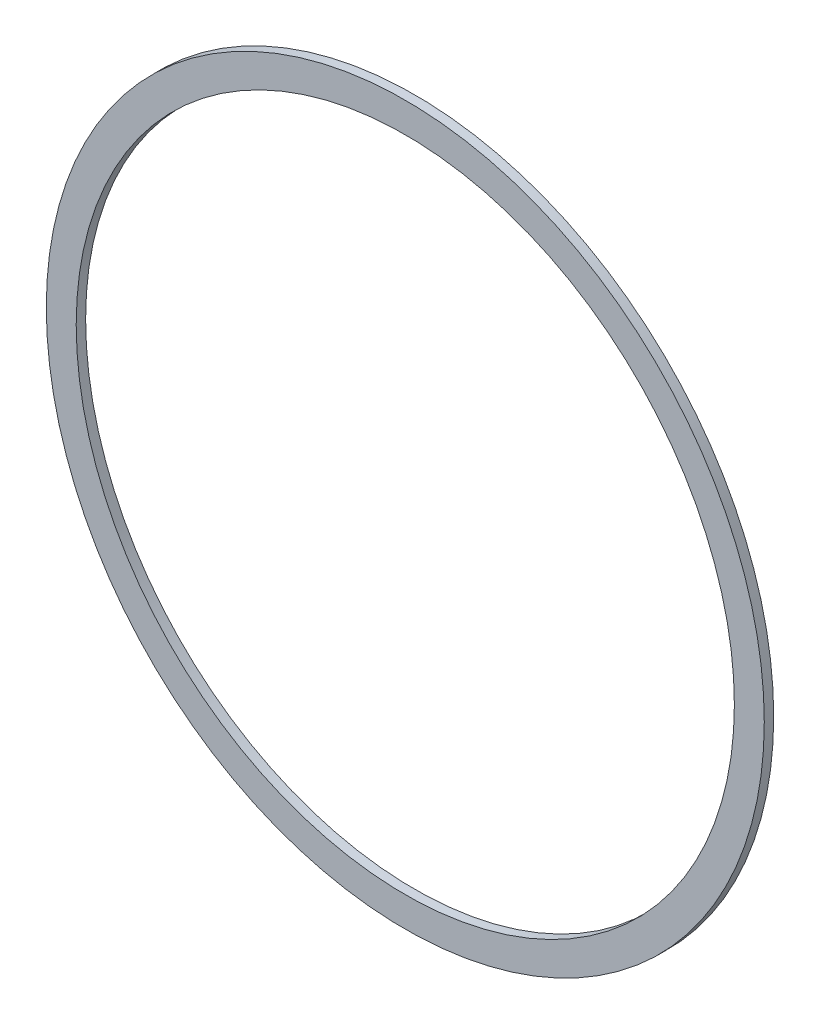
ISO-10303-21;
HEADER;
FILE_DESCRIPTION(('STEP AP214'),'2;1');
FILE_NAME('part.step','',(''),(''),'','','');
FILE_SCHEMA(('AUTOMOTIVE_DESIGN { 1 0 10303 214 1 1 1 1 }'));
ENDSEC;
DATA;
#1=APPLICATION_CONTEXT('core data for automotive mechanical design processes');
#2=APPLICATION_PROTOCOL_DEFINITION('international standard','automotive_design',2000,#1);
#3=PRODUCT_CONTEXT('',#1,'mechanical');
#4=PRODUCT('Part','Part','',(#3));
#5=PRODUCT_RELATED_PRODUCT_CATEGORY('part','',(#4));
#6=PRODUCT_DEFINITION_FORMATION('','',#4);
#7=PRODUCT_DEFINITION_CONTEXT('part definition',#1,'design');
#8=PRODUCT_DEFINITION('design','',#6,#7);
#9=PRODUCT_DEFINITION_SHAPE('','',#8);
#10=(LENGTH_UNIT() NAMED_UNIT(*) SI_UNIT(.MILLI.,.METRE.));
#11=(NAMED_UNIT(*) PLANE_ANGLE_UNIT() SI_UNIT($,.RADIAN.));
#12=(NAMED_UNIT(*) SI_UNIT($,.STERADIAN.) SOLID_ANGLE_UNIT());
#13=UNCERTAINTY_MEASURE_WITH_UNIT(LENGTH_MEASURE(1.E-05),#10,'distance_accuracy_value','');
#14=(GEOMETRIC_REPRESENTATION_CONTEXT(3) GLOBAL_UNCERTAINTY_ASSIGNED_CONTEXT((#13)) GLOBAL_UNIT_ASSIGNED_CONTEXT((#10,
#11,#12)) REPRESENTATION_CONTEXT('',''));
#15=CARTESIAN_POINT('',(0.,0.,0.));
#16=DIRECTION('',(0.,0.,1.));
#17=DIRECTION('',(1.,0.,0.));
#18=AXIS2_PLACEMENT_3D('',#15,#16,#17);
#19=CARTESIAN_POINT('',(0.,0.,1.));
#20=DIRECTION('',(0.,0.,1.));
#21=DIRECTION('',(1.,0.,0.));
#22=AXIS2_PLACEMENT_3D('',#19,#20,#21);
#23=PLANE('',#22);
#24=CARTESIAN_POINT('',(0.,0.,1.));
#25=DIRECTION('',(0.,0.,1.));
#26=DIRECTION('',(1.,0.,0.));
#27=AXIS2_PLACEMENT_3D('',#24,#25,#26);
#28=CIRCLE('',#27,76.2);
#29=CARTESIAN_POINT('',(76.2,0.,1.));
#30=VERTEX_POINT('',#29);
#31=EDGE_CURVE('E10',#30,#30,#28,.T.);
#32=ORIENTED_EDGE('',*,*,#31,.T.);
#33=EDGE_LOOP('',(#32));
#34=FACE_BOUND('',#33,.T.);
#35=CARTESIAN_POINT('',(0.,0.,1.));
#36=DIRECTION('',(0.,0.,1.));
#37=DIRECTION('',(1.,0.,0.));
#38=AXIS2_PLACEMENT_3D('',#35,#36,#37);
#39=CIRCLE('',#38,69.85);
#40=CARTESIAN_POINT('',(69.85,0.,1.));
#41=VERTEX_POINT('',#40);
#42=EDGE_CURVE('E42',#41,#41,#39,.T.);
#43=ORIENTED_EDGE('',*,*,#42,.F.);
#44=EDGE_LOOP('',(#43));
#45=FACE_BOUND('',#44,.T.);
#46=ADVANCED_FACE('F31',(#34,#45),#23,.T.);
#47=CARTESIAN_POINT('',(0.,0.,-1.));
#48=DIRECTION('',(0.,0.,1.));
#49=DIRECTION('',(1.,0.,0.));
#50=AXIS2_PLACEMENT_3D('',#47,#48,#49);
#51=PLANE('',#50);
#52=CARTESIAN_POINT('',(0.,0.,-1.));
#53=DIRECTION('',(0.,0.,1.));
#54=DIRECTION('',(1.,0.,0.));
#55=AXIS2_PLACEMENT_3D('',#52,#53,#54);
#56=CIRCLE('',#55,76.2);
#57=CARTESIAN_POINT('',(76.2,0.,-1.));
#58=VERTEX_POINT('',#57);
#59=EDGE_CURVE('E35',#58,#58,#56,.T.);
#60=ORIENTED_EDGE('',*,*,#59,.F.);
#61=EDGE_LOOP('',(#60));
#62=FACE_BOUND('',#61,.T.);
#63=CARTESIAN_POINT('',(0.,0.,-1.));
#64=DIRECTION('',(0.,0.,1.));
#65=DIRECTION('',(1.,0.,0.));
#66=AXIS2_PLACEMENT_3D('',#63,#64,#65);
#67=CIRCLE('',#66,69.85);
#68=CARTESIAN_POINT('',(69.85,0.,-1.));
#69=VERTEX_POINT('',#68);
#70=EDGE_CURVE('E44',#69,#69,#67,.T.);
#71=ORIENTED_EDGE('',*,*,#70,.T.);
#72=EDGE_LOOP('',(#71));
#73=FACE_BOUND('',#72,.T.);
#74=ADVANCED_FACE('F54',(#62,#73),#51,.F.);
#75=CARTESIAN_POINT('',(0.,0.,1.));
#76=DIRECTION('',(0.,0.,-1.));
#77=DIRECTION('',(-1.,0.,0.));
#78=AXIS2_PLACEMENT_3D('',#75,#76,#77);
#79=CYLINDRICAL_SURFACE('',#78,76.2);
#80=ORIENTED_EDGE('',*,*,#31,.F.);
#81=EDGE_LOOP('',(#80));
#82=FACE_BOUND('',#81,.T.);
#83=ORIENTED_EDGE('',*,*,#59,.T.);
#84=EDGE_LOOP('',(#83));
#85=FACE_BOUND('',#84,.T.);
#86=ADVANCED_FACE('F33',(#82,#85),#79,.T.);
#87=CARTESIAN_POINT('',(0.,0.,1.));
#88=DIRECTION('',(0.,0.,-1.));
#89=DIRECTION('',(-1.,0.,0.));
#90=AXIS2_PLACEMENT_3D('',#87,#88,#89);
#91=CYLINDRICAL_SURFACE('',#90,69.85);
#92=ORIENTED_EDGE('',*,*,#42,.T.);
#93=EDGE_LOOP('',(#92));
#94=FACE_BOUND('',#93,.T.);
#95=ORIENTED_EDGE('',*,*,#70,.F.);
#96=EDGE_LOOP('',(#95));
#97=FACE_BOUND('',#96,.T.);
#98=ADVANCED_FACE('F50',(#94,#97),#91,.F.);
#99=CLOSED_SHELL('',(#46,#74,#86,#98));
#100=MANIFOLD_SOLID_BREP('B2',#99);
#101=ADVANCED_BREP_SHAPE_REPRESENTATION('',(#18,#100),#14);
#102=SHAPE_DEFINITION_REPRESENTATION(#9,#101);
ENDSEC;
END-ISO-10303-21;
